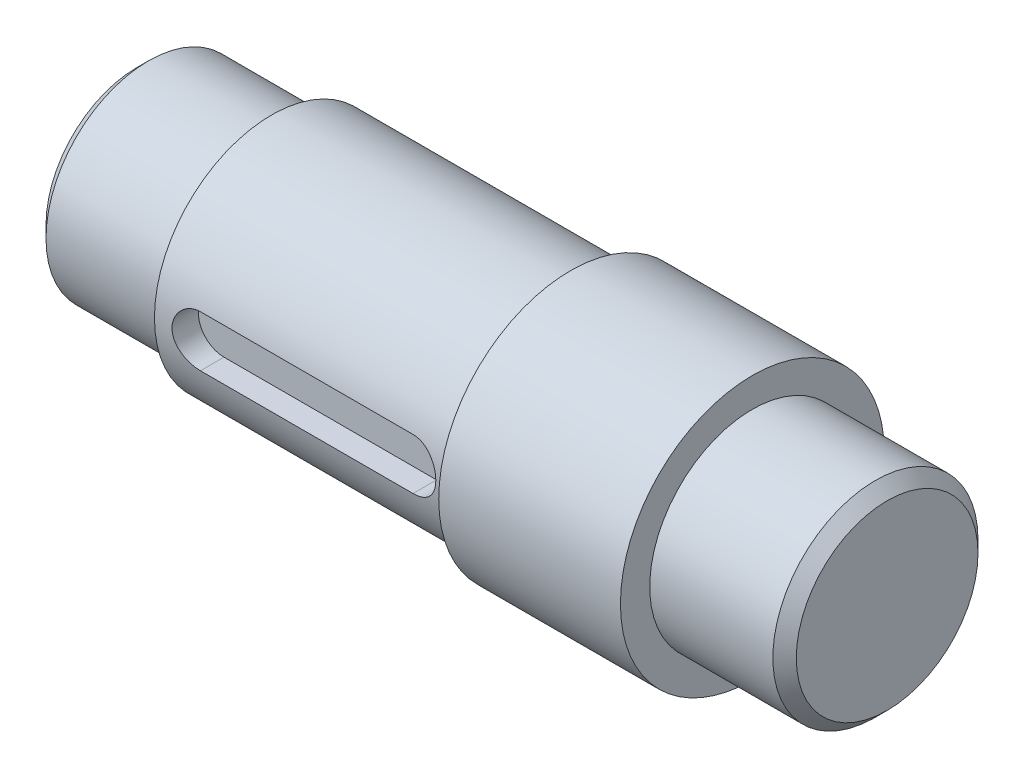
ISO-10303-21;
HEADER;
FILE_DESCRIPTION(('STEP AP214'),'2;1');
FILE_NAME('part.step','',(''),(''),'','','');
FILE_SCHEMA(('AUTOMOTIVE_DESIGN { 1 0 10303 214 1 1 1 1 }'));
ENDSEC;
DATA;
#1=APPLICATION_CONTEXT('core data for automotive mechanical design processes');
#2=APPLICATION_PROTOCOL_DEFINITION('international standard','automotive_design',2000,#1);
#3=PRODUCT_CONTEXT('',#1,'mechanical');
#4=PRODUCT('Part','Part','',(#3));
#5=PRODUCT_RELATED_PRODUCT_CATEGORY('part','',(#4));
#6=PRODUCT_DEFINITION_FORMATION('','',#4);
#7=PRODUCT_DEFINITION_CONTEXT('part definition',#1,'design');
#8=PRODUCT_DEFINITION('design','',#6,#7);
#9=PRODUCT_DEFINITION_SHAPE('','',#8);
#10=(LENGTH_UNIT() NAMED_UNIT(*) SI_UNIT(.MILLI.,.METRE.));
#11=(NAMED_UNIT(*) PLANE_ANGLE_UNIT() SI_UNIT($,.RADIAN.));
#12=(NAMED_UNIT(*) SI_UNIT($,.STERADIAN.) SOLID_ANGLE_UNIT());
#13=UNCERTAINTY_MEASURE_WITH_UNIT(LENGTH_MEASURE(1.E-05),#10,'distance_accuracy_value','');
#14=(GEOMETRIC_REPRESENTATION_CONTEXT(3) GLOBAL_UNCERTAINTY_ASSIGNED_CONTEXT((#13)) GLOBAL_UNIT_ASSIGNED_CONTEXT((#10,
#11,#12)) REPRESENTATION_CONTEXT('',''));
#15=CARTESIAN_POINT('',(0.,0.,0.));
#16=DIRECTION('',(0.,0.,1.));
#17=DIRECTION('',(1.,0.,0.));
#18=AXIS2_PLACEMENT_3D('',#15,#16,#17);
#19=CARTESIAN_POINT('',(74.,0.,0.));
#20=DIRECTION('',(-1.,0.,0.));
#21=DIRECTION('',(0.,0.,1.));
#22=AXIS2_PLACEMENT_3D('',#19,#20,#21);
#23=CYLINDRICAL_SURFACE('',#22,20.);
#24=CARTESIAN_POINT('',(74.,0.,0.));
#25=DIRECTION('',(-1.,0.,0.));
#26=DIRECTION('',(0.,0.,1.));
#27=AXIS2_PLACEMENT_3D('',#24,#25,#26);
#28=CIRCLE('',#27,20.);
#29=CARTESIAN_POINT('',(74.,0.,20.));
#30=VERTEX_POINT('',#29);
#31=EDGE_CURVE('E135',#30,#30,#28,.T.);
#32=ORIENTED_EDGE('',*,*,#31,.T.);
#33=EDGE_LOOP('',(#32));
#34=FACE_BOUND('',#33,.T.);
#35=CARTESIAN_POINT('',(23.,0.,0.));
#36=DIRECTION('',(-1.,0.,0.));
#37=DIRECTION('',(0.,0.,1.));
#38=AXIS2_PLACEMENT_3D('',#35,#36,#37);
#39=CIRCLE('',#38,20.);
#40=CARTESIAN_POINT('',(23.,0.,20.));
#41=VERTEX_POINT('',#40);
#42=EDGE_CURVE('E134',#41,#41,#39,.F.);
#43=ORIENTED_EDGE('',*,*,#42,.T.);
#44=EDGE_LOOP('',(#43));
#45=FACE_BOUND('',#44,.T.);
#46=DIRECTION('',(-1.,0.,0.));
#47=VECTOR('',#46,1.);
#48=CARTESIAN_POINT('',(74.,-4.36260949137126,19.5183923115045));
#49=LINE('',#48,#47);
#50=CARTESIAN_POINT('',(66.6373905086287,-4.36260949137126,19.5183923115045));
#51=VERTEX_POINT('',#50);
#52=CARTESIAN_POINT('',(30.3626094913713,-4.36260949137126,19.5183923115045));
#53=VERTEX_POINT('',#52);
#54=EDGE_CURVE('E168',#51,#53,#49,.T.);
#55=ORIENTED_EDGE('',*,*,#54,.T.);
#56=CARTESIAN_POINT('',(30.3626094913713,-4.36260949137126,19.5183923115045));
#57=CARTESIAN_POINT('',(30.2414694726373,-4.36262417288028,19.5183803834488));
#58=CARTESIAN_POINT('',(30.1203338007044,-4.35756441135076,19.5195196918423));
#59=CARTESIAN_POINT('',(29.8789585185348,-4.33740406391373,19.5240140011845));
#60=CARTESIAN_POINT('',(29.7587187864756,-4.32230486924226,19.5273686951309));
#61=CARTESIAN_POINT('',(29.5201884837352,-4.28220724582973,19.5361996435107));
#62=CARTESIAN_POINT('',(29.4018949875636,-4.25722542775349,19.5416723376866));
#63=CARTESIAN_POINT('',(29.1678896930971,-4.19756902665119,19.5545736552639));
#64=CARTESIAN_POINT('',(29.0521779136417,-4.16289437291863,19.5620022929333));
#65=CARTESIAN_POINT('',(28.8241511990919,-4.08412162123556,19.5785997360745));
#66=CARTESIAN_POINT('',(28.7118356980913,-4.04002510319414,19.5877682497657));
#67=CARTESIAN_POINT('',(28.4913328296696,-3.94274427256689,19.6075808760156));
#68=CARTESIAN_POINT('',(28.383147009135,-3.88955659471594,19.618225534721));
#69=CARTESIAN_POINT('',(28.0659429568357,-3.7169221920541,19.6519278386356));
#70=CARTESIAN_POINT('',(27.8640711578401,-3.58433228424148,19.6767697051557));
#71=CARTESIAN_POINT('',(27.4823320620476,-3.28573341455753,19.7288415716447));
#72=CARTESIAN_POINT('',(27.3028390792123,-3.11925423273603,19.7561017353538));
#73=CARTESIAN_POINT('',(26.9740466968793,-2.7585383073097,19.8096859459236));
#74=CARTESIAN_POINT('',(26.8247520174114,-2.56429723257346,19.836009845916));
#75=CARTESIAN_POINT('',(26.5591703450214,-2.15108363757002,19.8850826179295));
#76=CARTESIAN_POINT('',(26.4432442676113,-1.93187406737826,19.9077912926008));
#77=CARTESIAN_POINT('',(26.2500190353259,-1.47651767393381,19.9467299789218));
#78=CARTESIAN_POINT('',(26.1727135352279,-1.24037364024824,19.9629610547296));
#79=CARTESIAN_POINT('',(26.0600981648627,-0.761745163204436,19.9869017123987));
#80=CARTESIAN_POINT('',(26.0241530337568,-0.519416732071978,19.9947400653581));
#81=CARTESIAN_POINT('',(25.9932914937278,-0.0320452662202347,20.0014583748695));
#82=CARTESIAN_POINT('',(25.9983713534851,0.212997519597663,20.0003391461347));
#83=CARTESIAN_POINT('',(26.0489447128428,0.694451609365139,19.9893664245538));
#84=CARTESIAN_POINT('',(26.0937525065126,0.93093880932556,19.9796611337551));
#85=CARTESIAN_POINT('',(26.2214140588507,1.39295116973121,19.9527759991549));
#86=CARTESIAN_POINT('',(26.3042692317874,1.61847592234403,19.9355958775058));
#87=CARTESIAN_POINT('',(26.5062927509895,2.05407820645105,19.8954516779879));
#88=CARTESIAN_POINT('',(26.6257219102331,2.26403087911824,19.872446270359));
#89=CARTESIAN_POINT('',(26.8972666360747,2.66114150857242,19.8231791434207));
#90=CARTESIAN_POINT('',(27.0493856798413,2.8482970371445,19.7969170778318));
#91=CARTESIAN_POINT('',(27.385851044387,3.19865179253116,19.7433715498645));
#92=CARTESIAN_POINT('',(27.5707962860933,3.36127859549908,19.716078190337));
#93=CARTESIAN_POINT('',(27.8667068160465,3.58021939922473,19.6770817918439));
#94=CARTESIAN_POINT('',(27.968501062431,3.64907127862056,19.664398995362));
#95=CARTESIAN_POINT('',(28.1776089470261,3.77798785182715,19.6400383200095));
#96=CARTESIAN_POINT('',(28.2849204513184,3.83805590892446,19.6283600572165));
#97=CARTESIAN_POINT('',(28.5047640432081,3.94917818780874,19.6063055486749));
#98=CARTESIAN_POINT('',(28.6173148500453,4.00019636109602,19.5959345556142));
#99=CARTESIAN_POINT('',(28.8464191364038,4.09252641438297,19.5768600610712));
#100=CARTESIAN_POINT('',(28.9629710199254,4.13384211422624,19.5681559036092));
#101=CARTESIAN_POINT('',(29.1991541499134,4.20642145573224,19.5526825789778));
#102=CARTESIAN_POINT('',(29.3187820599262,4.23769553040904,19.5459114043013));
#103=CARTESIAN_POINT('',(29.560310465391,4.28998078885631,19.5345023165995));
#104=CARTESIAN_POINT('',(29.6822098573768,4.31099682756485,19.5298633944794));
#105=CARTESIAN_POINT('',(29.8973150401647,4.33872858611277,19.5237185664949));
#106=CARTESIAN_POINT('',(29.9902242002016,4.34768762468696,19.5217232590471));
#107=CARTESIAN_POINT('',(30.1762893142571,4.3596250774706,19.5190593356225));
#108=CARTESIAN_POINT('',(30.2694445997903,4.36261342467377,19.5183885162157));
#109=CARTESIAN_POINT('',(30.3626094913713,4.36260949137126,19.5183923115045));
#110=B_SPLINE_CURVE_WITH_KNOTS('',3,(#56,#57,#58,#59,#60,#61,#62,#63,#64,#65,#66,#67,#68,#69,
#70,#71,#72,#73,#74,#75,#76,#77,#78,#79,#80,#81,#82,#83,#84,#85,#86,#87,#88,#89,#90,#91,#92,#93,
#94,#95,#96,#97,#98,#99,#100,#101,#102,#103,#104,#105,#106,#107,#108,#109),.UNSPECIFIED.,.F.,
.F.,(4,2,2,2,2,2,2,2,2,2,2,2,2,2,2,2,2,2,2,2,2,2,2,2,2,2,4),(0.,0.363302398538328,
0.726554462154867,1.08919855006866,1.45184528343728,1.81443125390101,2.17715173426338,
2.90194182530799,3.63757341609595,4.37331989825583,5.11674845148471,5.86005482185886,
6.59178547754205,7.3234495813474,8.0427257646873,8.76202868658033,9.48658543292429,
10.2112192873417,10.9507692186973,11.3210465503355,11.6911817310921,12.0627596937603,
12.4341911207853,12.8052353810268,13.1761038622178,13.455995563792,13.7354212414199),.UNSPECIFIED.);
#111=CARTESIAN_POINT('',(30.3626094913713,4.36260949137126,19.5183923115045));
#112=VERTEX_POINT('',#111);
#113=EDGE_CURVE('E76',#53,#112,#110,.T.);
#114=ORIENTED_EDGE('',*,*,#113,.T.);
#115=DIRECTION('',(-1.,0.,0.));
#116=VECTOR('',#115,1.);
#117=CARTESIAN_POINT('',(74.,4.36260949137126,19.5183923115045));
#118=LINE('',#117,#116);
#119=CARTESIAN_POINT('',(66.6373905086287,4.36260949137126,19.5183923115045));
#120=VERTEX_POINT('',#119);
#121=EDGE_CURVE('E148',#112,#120,#118,.F.);
#122=ORIENTED_EDGE('',*,*,#121,.T.);
#123=CARTESIAN_POINT('',(66.6373905086287,4.36260949137126,19.5183923115045));
#124=CARTESIAN_POINT('',(66.7585305273627,4.36262417288028,19.5183803834488));
#125=CARTESIAN_POINT('',(66.8796661992956,4.35756441135076,19.5195196918423));
#126=CARTESIAN_POINT('',(67.1210414814652,4.33740406391373,19.5240140011845));
#127=CARTESIAN_POINT('',(67.2412812135244,4.32230486924226,19.5273686951309));
#128=CARTESIAN_POINT('',(67.4798115162648,4.28220724582973,19.5361996435107));
#129=CARTESIAN_POINT('',(67.5981050124364,4.25722542775349,19.5416723376866));
#130=CARTESIAN_POINT('',(67.8321103069029,4.19756902665119,19.5545736552639));
#131=CARTESIAN_POINT('',(67.9478220863583,4.16289437291863,19.5620022929333));
#132=CARTESIAN_POINT('',(68.1758488009081,4.08412162123557,19.5785997360745));
#133=CARTESIAN_POINT('',(68.2881643019087,4.04002510319414,19.5877682497657));
#134=CARTESIAN_POINT('',(68.5086671703304,3.9427442725669,19.6075808760156));
#135=CARTESIAN_POINT('',(68.616852990865,3.88955659471595,19.618225534721));
#136=CARTESIAN_POINT('',(68.9340570431643,3.7169221920541,19.6519278386356));
#137=CARTESIAN_POINT('',(69.1359288421599,3.58433228424149,19.6767697051557));
#138=CARTESIAN_POINT('',(69.5176679379524,3.28573341455754,19.7288415716447));
#139=CARTESIAN_POINT('',(69.6971609207877,3.11925423273604,19.7561017353538));
#140=CARTESIAN_POINT('',(70.0259533031207,2.75853830730971,19.8096859459236));
#141=CARTESIAN_POINT('',(70.1752479825886,2.56429723257347,19.836009845916));
#142=CARTESIAN_POINT('',(70.4408296549786,2.15108363757003,19.8850826179295));
#143=CARTESIAN_POINT('',(70.5567557323887,1.93187406737826,19.9077912926008));
#144=CARTESIAN_POINT('',(70.7499809646741,1.47651767393382,19.9467299789218));
#145=CARTESIAN_POINT('',(70.8272864647721,1.24037364024824,19.9629610547296));
#146=CARTESIAN_POINT('',(70.9399018351373,0.761745163204442,19.9869017123987));
#147=CARTESIAN_POINT('',(70.9758469662432,0.519416732071984,19.9947400653581));
#148=CARTESIAN_POINT('',(71.0067085062721,0.0320452662202399,20.0014583748695));
#149=CARTESIAN_POINT('',(71.0016286465149,-0.212997519597659,20.0003391461347));
#150=CARTESIAN_POINT('',(70.9510552871572,-0.694451609365135,19.9893664245538));
#151=CARTESIAN_POINT('',(70.9062474934874,-0.930938809325555,19.9796611337551));
#152=CARTESIAN_POINT('',(70.7785859411493,-1.3929511697312,19.9527759991549));
#153=CARTESIAN_POINT('',(70.6957307682126,-1.61847592234402,19.9355958775058));
#154=CARTESIAN_POINT('',(70.4937072490105,-2.05407820645104,19.8954516779879));
#155=CARTESIAN_POINT('',(70.3742780897669,-2.26403087911824,19.872446270359));
#156=CARTESIAN_POINT('',(70.1027333639253,-2.66114150857241,19.8231791434207));
#157=CARTESIAN_POINT('',(69.9506143201587,-2.84829703714449,19.7969170778318));
#158=CARTESIAN_POINT('',(69.614148955613,-3.19865179253116,19.7433715498645));
#159=CARTESIAN_POINT('',(69.4292037139067,-3.36127859549908,19.716078190337));
#160=CARTESIAN_POINT('',(69.1332931839535,-3.58021939922473,19.6770817918439));
#161=CARTESIAN_POINT('',(69.031498937569,-3.64907127862057,19.664398995362));
#162=CARTESIAN_POINT('',(68.8223910529739,-3.77798785182715,19.6400383200095));
#163=CARTESIAN_POINT('',(68.7150795486816,-3.83805590892446,19.6283600572165));
#164=CARTESIAN_POINT('',(68.4952359567919,-3.94917818780874,19.6063055486749));
#165=CARTESIAN_POINT('',(68.3826851499547,-4.00019636109601,19.5959345556142));
#166=CARTESIAN_POINT('',(68.1535808635962,-4.09252641438297,19.5768600610712));
#167=CARTESIAN_POINT('',(68.0370289800746,-4.13384211422624,19.5681559036092));
#168=CARTESIAN_POINT('',(67.8008458500866,-4.20642145573223,19.5526825789778));
#169=CARTESIAN_POINT('',(67.6812179400738,-4.23769553040904,19.5459114043013));
#170=CARTESIAN_POINT('',(67.439689534609,-4.28998078885631,19.5345023165995));
#171=CARTESIAN_POINT('',(67.3177901426232,-4.31099682756485,19.5298633944794));
#172=CARTESIAN_POINT('',(67.1026849598353,-4.33872858611277,19.5237185664949));
#173=CARTESIAN_POINT('',(67.0097757997984,-4.34768762468697,19.5217232590471));
#174=CARTESIAN_POINT('',(66.8237106857429,-4.3596250774706,19.5190593356225));
#175=CARTESIAN_POINT('',(66.7305554002097,-4.36261342467377,19.5183885162157));
#176=CARTESIAN_POINT('',(66.6373905086287,-4.36260949137126,19.5183923115045));
#177=B_SPLINE_CURVE_WITH_KNOTS('',3,(#123,#124,#125,#126,#127,#128,#129,#130,#131,#132,#133,
#134,#135,#136,#137,#138,#139,#140,#141,#142,#143,#144,#145,#146,#147,#148,#149,#150,#151,#152,
#153,#154,#155,#156,#157,#158,#159,#160,#161,#162,#163,#164,#165,#166,#167,#168,#169,#170,#171,
#172,#173,#174,#175,#176),.UNSPECIFIED.,.F.,.F.,(4,2,2,2,2,2,2,2,2,2,2,2,2,2,2,2,2,2,2,2,2,2,2,
2,2,2,4),(0.,0.363302398538307,0.726554462154853,1.08919855006865,1.45184528343728,
1.814431253901,2.17715173426337,2.90194182530797,3.63757341609595,4.37331989825581,
5.1167484514847,5.86005482185886,6.59178547754204,7.3234495813474,8.04272576468729,
8.76202868658032,9.48658543292427,10.2112192873417,10.9507692186973,11.3210465503355,
11.6911817310921,12.0627596937603,12.4341911207853,12.8052353810268,13.1761038622178,
13.455995563792,13.7354212414199),.UNSPECIFIED.);
#178=EDGE_CURVE('E158',#120,#51,#177,.T.);
#179=ORIENTED_EDGE('',*,*,#178,.T.);
#180=EDGE_LOOP('',(#55,#114,#122,#179));
#181=FACE_BOUND('',#180,.T.);
#182=ADVANCED_FACE('F51',(#34,#45,#181),#23,.T.);
#183=CARTESIAN_POINT('',(128.,0.,0.));
#184=DIRECTION('',(-1.,0.,0.));
#185=DIRECTION('',(0.,0.,1.));
#186=AXIS2_PLACEMENT_3D('',#183,#184,#185);
#187=CYLINDRICAL_SURFACE('',#186,22.5);
#188=CARTESIAN_POINT('',(105.,0.,0.));
#189=DIRECTION('',(1.,0.,0.));
#190=DIRECTION('',(0.,0.,-1.));
#191=AXIS2_PLACEMENT_3D('',#188,#189,#190);
#192=CIRCLE('',#191,22.5);
#193=CARTESIAN_POINT('',(105.,0.,-22.5));
#194=VERTEX_POINT('',#193);
#195=EDGE_CURVE('E144',#194,#194,#192,.T.);
#196=ORIENTED_EDGE('',*,*,#195,.F.);
#197=EDGE_LOOP('',(#196));
#198=FACE_BOUND('',#197,.T.);
#199=CARTESIAN_POINT('',(74.,0.,0.));
#200=DIRECTION('',(-1.,0.,0.));
#201=DIRECTION('',(0.,0.,1.));
#202=AXIS2_PLACEMENT_3D('',#199,#200,#201);
#203=CIRCLE('',#202,22.5);
#204=CARTESIAN_POINT('',(74.,0.,22.5));
#205=VERTEX_POINT('',#204);
#206=EDGE_CURVE('E139',#205,#205,#203,.T.);
#207=ORIENTED_EDGE('',*,*,#206,.F.);
#208=EDGE_LOOP('',(#207));
#209=FACE_BOUND('',#208,.T.);
#210=ADVANCED_FACE('F216',(#198,#209),#187,.T.);
#211=CARTESIAN_POINT('',(105.,0.,0.));
#212=DIRECTION('',(1.,0.,0.));
#213=DIRECTION('',(0.,0.,-1.));
#214=AXIS2_PLACEMENT_3D('',#211,#212,#213);
#215=PLANE('',#214);
#216=CARTESIAN_POINT('',(105.,0.,0.));
#217=DIRECTION('',(1.,0.,0.));
#218=DIRECTION('',(0.,0.,-1.));
#219=AXIS2_PLACEMENT_3D('',#216,#217,#218);
#220=CIRCLE('',#219,17.5);
#221=CARTESIAN_POINT('',(105.,0.,-17.5));
#222=VERTEX_POINT('',#221);
#223=EDGE_CURVE('E140',#222,#222,#220,.T.);
#224=ORIENTED_EDGE('',*,*,#223,.F.);
#225=EDGE_LOOP('',(#224));
#226=FACE_BOUND('',#225,.T.);
#227=ORIENTED_EDGE('',*,*,#195,.T.);
#228=EDGE_LOOP('',(#227));
#229=FACE_BOUND('',#228,.T.);
#230=ADVANCED_FACE('F221',(#226,#229),#215,.T.);
#231=CARTESIAN_POINT('',(105.,0.,0.));
#232=DIRECTION('',(1.,0.,0.));
#233=DIRECTION('',(0.,0.,-1.));
#234=AXIS2_PLACEMENT_3D('',#231,#232,#233);
#235=CYLINDRICAL_SURFACE('',#234,17.5);
#236=CARTESIAN_POINT('',(126.,0.,0.));
#237=DIRECTION('',(1.,0.,0.));
#238=DIRECTION('',(0.,0.,-1.));
#239=AXIS2_PLACEMENT_3D('',#236,#237,#238);
#240=CIRCLE('',#239,17.5);
#241=CARTESIAN_POINT('',(126.,0.,-17.5));
#242=VERTEX_POINT('',#241);
#243=EDGE_CURVE('E13',#242,#242,#240,.F.);
#244=ORIENTED_EDGE('',*,*,#243,.T.);
#245=EDGE_LOOP('',(#244));
#246=FACE_BOUND('',#245,.T.);
#247=ORIENTED_EDGE('',*,*,#223,.T.);
#248=EDGE_LOOP('',(#247));
#249=FACE_BOUND('',#248,.T.);
#250=ADVANCED_FACE('F328',(#246,#249),#235,.T.);
#251=CARTESIAN_POINT('',(128.,0.,0.));
#252=DIRECTION('',(1.,0.,0.));
#253=DIRECTION('',(0.,0.,-1.));
#254=AXIS2_PLACEMENT_3D('',#251,#252,#253);
#255=PLANE('',#254);
#256=CARTESIAN_POINT('',(128.,0.,0.));
#257=DIRECTION('',(1.,0.,0.));
#258=DIRECTION('',(0.,0.,-1.));
#259=AXIS2_PLACEMENT_3D('',#256,#257,#258);
#260=CIRCLE('',#259,15.5);
#261=CARTESIAN_POINT('',(128.,0.,-15.5));
#262=VERTEX_POINT('',#261);
#263=EDGE_CURVE('E61',#262,#262,#260,.T.);
#264=ORIENTED_EDGE('',*,*,#263,.T.);
#265=EDGE_LOOP('',(#264));
#266=FACE_BOUND('',#265,.T.);
#267=ADVANCED_FACE('F205',(#266),#255,.T.);
#268=CARTESIAN_POINT('',(74.,0.,0.));
#269=DIRECTION('',(-1.,0.,0.));
#270=DIRECTION('',(0.,0.,1.));
#271=AXIS2_PLACEMENT_3D('',#268,#269,#270);
#272=PLANE('',#271);
#273=ORIENTED_EDGE('',*,*,#31,.F.);
#274=EDGE_LOOP('',(#273));
#275=FACE_BOUND('',#274,.T.);
#276=ORIENTED_EDGE('',*,*,#206,.T.);
#277=EDGE_LOOP('',(#276));
#278=FACE_BOUND('',#277,.T.);
#279=ADVANCED_FACE('F303',(#275,#278),#272,.T.);
#280=CARTESIAN_POINT('',(151.045102110842,0.,0.));
#281=DIRECTION('',(-1.,0.,0.));
#282=DIRECTION('',(0.,0.,1.));
#283=AXIS2_PLACEMENT_3D('',#280,#281,#282);
#284=CYLINDRICAL_SURFACE('',#283,17.5);
#285=CARTESIAN_POINT('',(2.,0.,0.));
#286=DIRECTION('',(1.,0.,0.));
#287=DIRECTION('',(0.,0.,-1.));
#288=AXIS2_PLACEMENT_3D('',#285,#286,#287);
#289=CIRCLE('',#288,17.5);
#290=CARTESIAN_POINT('',(2.,0.,-17.5));
#291=VERTEX_POINT('',#290);
#292=EDGE_CURVE('E198',#291,#291,#289,.T.);
#293=ORIENTED_EDGE('',*,*,#292,.T.);
#294=EDGE_LOOP('',(#293));
#295=FACE_BOUND('',#294,.T.);
#296=CARTESIAN_POINT('',(23.,0.,0.));
#297=DIRECTION('',(-1.,0.,0.));
#298=DIRECTION('',(0.,0.,1.));
#299=AXIS2_PLACEMENT_3D('',#296,#297,#298);
#300=CIRCLE('',#299,17.5);
#301=CARTESIAN_POINT('',(23.,0.,17.5));
#302=VERTEX_POINT('',#301);
#303=EDGE_CURVE('E101',#302,#302,#300,.F.);
#304=ORIENTED_EDGE('',*,*,#303,.F.);
#305=EDGE_LOOP('',(#304));
#306=FACE_BOUND('',#305,.T.);
#307=ADVANCED_FACE('F294',(#295,#306),#284,.T.);
#308=CARTESIAN_POINT('',(23.,0.,0.));
#309=DIRECTION('',(-1.,0.,0.));
#310=DIRECTION('',(0.,0.,1.));
#311=AXIS2_PLACEMENT_3D('',#308,#309,#310);
#312=PLANE('',#311);
#313=ORIENTED_EDGE('',*,*,#42,.F.);
#314=EDGE_LOOP('',(#313));
#315=FACE_BOUND('',#314,.T.);
#316=ORIENTED_EDGE('',*,*,#303,.T.);
#317=EDGE_LOOP('',(#316));
#318=FACE_BOUND('',#317,.T.);
#319=ADVANCED_FACE('F187',(#315,#318),#312,.T.);
#320=CARTESIAN_POINT('',(0.,0.,0.));
#321=DIRECTION('',(1.,0.,0.));
#322=DIRECTION('',(0.,0.,-1.));
#323=AXIS2_PLACEMENT_3D('',#320,#321,#322);
#324=PLANE('',#323);
#325=CARTESIAN_POINT('',(0.,0.,0.));
#326=DIRECTION('',(1.,0.,0.));
#327=DIRECTION('',(0.,0.,-1.));
#328=AXIS2_PLACEMENT_3D('',#325,#326,#327);
#329=CIRCLE('',#328,15.5);
#330=CARTESIAN_POINT('',(0.,0.,-15.5));
#331=VERTEX_POINT('',#330);
#332=EDGE_CURVE('E194',#331,#331,#329,.F.);
#333=ORIENTED_EDGE('',*,*,#332,.T.);
#334=EDGE_LOOP('',(#333));
#335=FACE_BOUND('',#334,.T.);
#336=ADVANCED_FACE('F186',(#335),#324,.F.);
#337=CARTESIAN_POINT('',(30.3626094913713,0.,22.5));
#338=DIRECTION('',(0.,0.,-1.));
#339=DIRECTION('',(-1.,0.,0.));
#340=AXIS2_PLACEMENT_3D('',#337,#338,#339);
#341=CYLINDRICAL_SURFACE('',#340,4.36260949137126);
#342=DIRECTION('',(0.,0.,-1.));
#343=VECTOR('',#342,1.);
#344=CARTESIAN_POINT('',(30.3626094913713,-4.36260949137126,22.5));
#345=LINE('',#344,#343);
#346=CARTESIAN_POINT('',(30.3626094913713,-4.36260949137126,15.5));
#347=VERTEX_POINT('',#346);
#348=EDGE_CURVE('E93',#53,#347,#345,.T.);
#349=ORIENTED_EDGE('',*,*,#348,.T.);
#350=CARTESIAN_POINT('',(30.3626094913713,0.,15.5));
#351=DIRECTION('',(0.,0.,1.));
#352=DIRECTION('',(1.,0.,0.));
#353=AXIS2_PLACEMENT_3D('',#350,#351,#352);
#354=CIRCLE('',#353,4.36260949137126);
#355=CARTESIAN_POINT('',(30.3626094913713,4.36260949137126,15.5));
#356=VERTEX_POINT('',#355);
#357=EDGE_CURVE('E97',#356,#347,#354,.T.);
#358=ORIENTED_EDGE('',*,*,#357,.F.);
#359=DIRECTION('',(0.,0.,-1.));
#360=VECTOR('',#359,1.);
#361=CARTESIAN_POINT('',(30.3626094913713,4.36260949137126,22.5));
#362=LINE('',#361,#360);
#363=EDGE_CURVE('E124',#112,#356,#362,.T.);
#364=ORIENTED_EDGE('',*,*,#363,.F.);
#365=ORIENTED_EDGE('',*,*,#113,.F.);
#366=EDGE_LOOP('',(#349,#358,#364,#365));
#367=FACE_BOUND('',#366,.T.);
#368=ADVANCED_FACE('F95',(#367),#341,.F.);
#369=CARTESIAN_POINT('',(30.3626094913713,-4.36260949137126,22.5));
#370=DIRECTION('',(0.,1.,0.));
#371=DIRECTION('',(0.,0.,1.));
#372=AXIS2_PLACEMENT_3D('',#369,#370,#371);
#373=PLANE('',#372);
#374=DIRECTION('',(0.,0.,-1.));
#375=VECTOR('',#374,1.);
#376=CARTESIAN_POINT('',(66.6373905086287,-4.36260949137126,22.5));
#377=LINE('',#376,#375);
#378=CARTESIAN_POINT('',(66.6373905086287,-4.36260949137126,15.5));
#379=VERTEX_POINT('',#378);
#380=EDGE_CURVE('E102',#51,#379,#377,.T.);
#381=ORIENTED_EDGE('',*,*,#380,.T.);
#382=DIRECTION('',(1.,0.,0.));
#383=VECTOR('',#382,1.);
#384=CARTESIAN_POINT('',(30.3626094913713,-4.36260949137126,15.5));
#385=LINE('',#384,#383);
#386=EDGE_CURVE('E105',#347,#379,#385,.T.);
#387=ORIENTED_EDGE('',*,*,#386,.F.);
#388=ORIENTED_EDGE('',*,*,#348,.F.);
#389=ORIENTED_EDGE('',*,*,#54,.F.);
#390=EDGE_LOOP('',(#381,#387,#388,#389));
#391=FACE_BOUND('',#390,.T.);
#392=ADVANCED_FACE('F106',(#391),#373,.T.);
#393=CARTESIAN_POINT('',(66.6373905086287,0.,22.5));
#394=DIRECTION('',(0.,0.,-1.));
#395=DIRECTION('',(-1.,0.,0.));
#396=AXIS2_PLACEMENT_3D('',#393,#394,#395);
#397=CYLINDRICAL_SURFACE('',#396,4.36260949137126);
#398=DIRECTION('',(0.,0.,-1.));
#399=VECTOR('',#398,1.);
#400=CARTESIAN_POINT('',(66.6373905086287,4.36260949137126,22.5));
#401=LINE('',#400,#399);
#402=CARTESIAN_POINT('',(66.6373905086287,4.36260949137126,15.5));
#403=VERTEX_POINT('',#402);
#404=EDGE_CURVE('E68',#120,#403,#401,.T.);
#405=ORIENTED_EDGE('',*,*,#404,.T.);
#406=CARTESIAN_POINT('',(66.6373905086287,0.,15.5));
#407=DIRECTION('',(0.,0.,1.));
#408=DIRECTION('',(1.,0.,0.));
#409=AXIS2_PLACEMENT_3D('',#406,#407,#408);
#410=CIRCLE('',#409,4.36260949137126);
#411=EDGE_CURVE('E112',#379,#403,#410,.T.);
#412=ORIENTED_EDGE('',*,*,#411,.F.);
#413=ORIENTED_EDGE('',*,*,#380,.F.);
#414=ORIENTED_EDGE('',*,*,#178,.F.);
#415=EDGE_LOOP('',(#405,#412,#413,#414));
#416=FACE_BOUND('',#415,.T.);
#417=ADVANCED_FACE('F173',(#416),#397,.F.);
#418=CARTESIAN_POINT('',(30.3626094913713,4.36260949137126,22.5));
#419=DIRECTION('',(0.,-1.,0.));
#420=DIRECTION('',(0.,0.,-1.));
#421=AXIS2_PLACEMENT_3D('',#418,#419,#420);
#422=PLANE('',#421);
#423=ORIENTED_EDGE('',*,*,#363,.T.);
#424=DIRECTION('',(-1.,0.,0.));
#425=VECTOR('',#424,1.);
#426=CARTESIAN_POINT('',(30.3626094913713,4.36260949137126,15.5));
#427=LINE('',#426,#425);
#428=EDGE_CURVE('E116',#403,#356,#427,.T.);
#429=ORIENTED_EDGE('',*,*,#428,.F.);
#430=ORIENTED_EDGE('',*,*,#404,.F.);
#431=ORIENTED_EDGE('',*,*,#121,.F.);
#432=EDGE_LOOP('',(#423,#429,#430,#431));
#433=FACE_BOUND('',#432,.T.);
#434=ADVANCED_FACE('F178',(#433),#422,.T.);
#435=CARTESIAN_POINT('',(30.3626094913713,0.,15.5));
#436=DIRECTION('',(0.,0.,1.));
#437=DIRECTION('',(1.,0.,0.));
#438=AXIS2_PLACEMENT_3D('',#435,#436,#437);
#439=PLANE('',#438);
#440=ORIENTED_EDGE('',*,*,#357,.T.);
#441=ORIENTED_EDGE('',*,*,#386,.T.);
#442=ORIENTED_EDGE('',*,*,#411,.T.);
#443=ORIENTED_EDGE('',*,*,#428,.T.);
#444=EDGE_LOOP('',(#440,#441,#442,#443));
#445=FACE_BOUND('',#444,.T.);
#446=ADVANCED_FACE('F115',(#445),#439,.T.);
#447=CARTESIAN_POINT('',(0.,0.,0.));
#448=DIRECTION('',(1.,0.,0.));
#449=DIRECTION('',(0.,0.,-1.));
#450=AXIS2_PLACEMENT_3D('',#447,#448,#449);
#451=CONICAL_SURFACE('',#450,15.5,0.785398163397446);
#452=ORIENTED_EDGE('',*,*,#292,.F.);
#453=EDGE_LOOP('',(#452));
#454=FACE_BOUND('',#453,.T.);
#455=ORIENTED_EDGE('',*,*,#332,.F.);
#456=EDGE_LOOP('',(#455));
#457=FACE_BOUND('',#456,.T.);
#458=ADVANCED_FACE('F208',(#454,#457),#451,.T.);
#459=CARTESIAN_POINT('',(128.,0.,0.));
#460=DIRECTION('',(-1.,0.,0.));
#461=DIRECTION('',(0.,0.,1.));
#462=AXIS2_PLACEMENT_3D('',#459,#460,#461);
#463=CONICAL_SURFACE('',#462,15.5,0.785398163397446);
#464=ORIENTED_EDGE('',*,*,#243,.F.);
#465=EDGE_LOOP('',(#464));
#466=FACE_BOUND('',#465,.T.);
#467=ORIENTED_EDGE('',*,*,#263,.F.);
#468=EDGE_LOOP('',(#467));
#469=FACE_BOUND('',#468,.T.);
#470=ADVANCED_FACE('F54',(#466,#469),#463,.T.);
#471=CLOSED_SHELL('',(#182,#210,#230,#250,#267,#279,#307,#319,#336,#368,#392,#417,#434,#446,
#458,#470));
#472=MANIFOLD_SOLID_BREP('B2',#471);
#473=ADVANCED_BREP_SHAPE_REPRESENTATION('',(#18,#472),#14);
#474=SHAPE_DEFINITION_REPRESENTATION(#9,#473);
ENDSEC;
END-ISO-10303-21;
